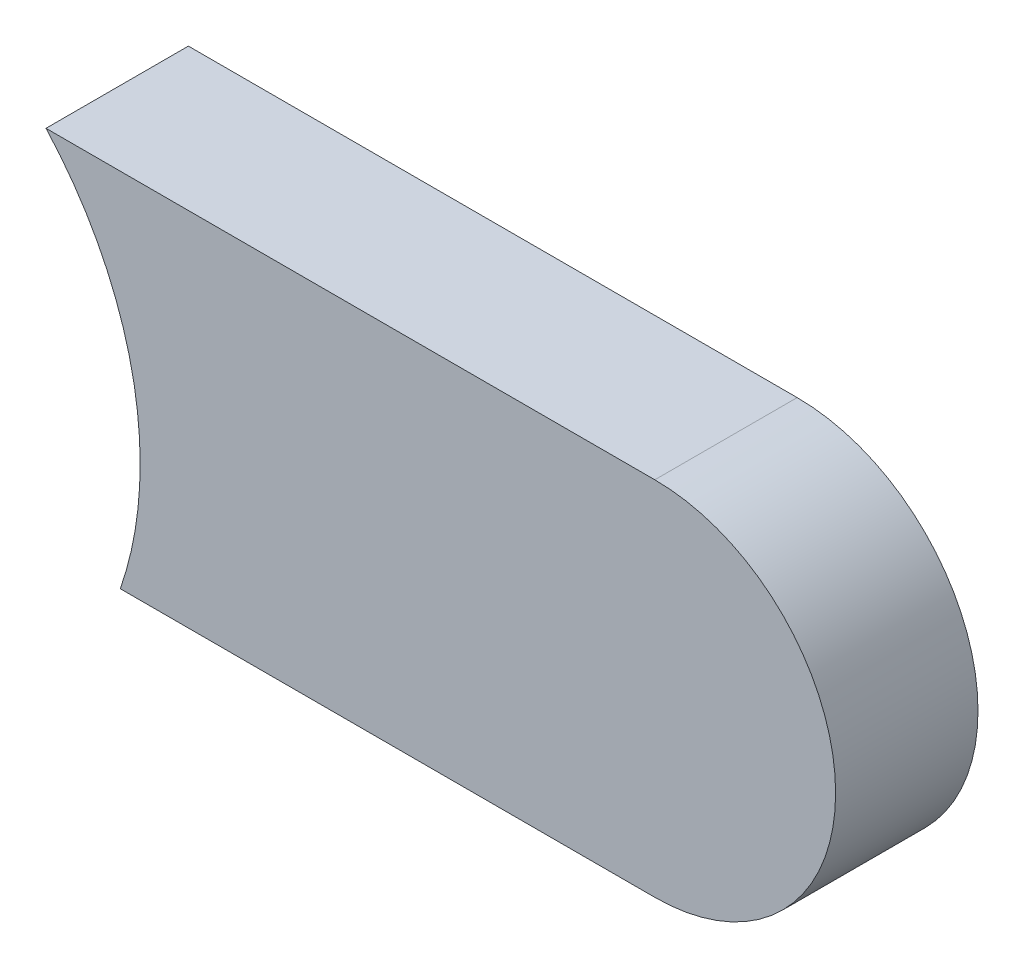
ISO-10303-21;
HEADER;
FILE_DESCRIPTION(('STEP AP214'),'2;1');
FILE_NAME('part.step','',(''),(''),'','','');
FILE_SCHEMA(('AUTOMOTIVE_DESIGN { 1 0 10303 214 1 1 1 1 }'));
ENDSEC;
DATA;
#1=APPLICATION_CONTEXT('core data for automotive mechanical design processes');
#2=APPLICATION_PROTOCOL_DEFINITION('international standard','automotive_design',2000,#1);
#3=PRODUCT_CONTEXT('',#1,'mechanical');
#4=PRODUCT('Part','Part','',(#3));
#5=PRODUCT_RELATED_PRODUCT_CATEGORY('part','',(#4));
#6=PRODUCT_DEFINITION_FORMATION('','',#4);
#7=PRODUCT_DEFINITION_CONTEXT('part definition',#1,'design');
#8=PRODUCT_DEFINITION('design','',#6,#7);
#9=PRODUCT_DEFINITION_SHAPE('','',#8);
#10=(LENGTH_UNIT() NAMED_UNIT(*) SI_UNIT(.MILLI.,.METRE.));
#11=(NAMED_UNIT(*) PLANE_ANGLE_UNIT() SI_UNIT($,.RADIAN.));
#12=(NAMED_UNIT(*) SI_UNIT($,.STERADIAN.) SOLID_ANGLE_UNIT());
#13=UNCERTAINTY_MEASURE_WITH_UNIT(LENGTH_MEASURE(1.E-05),#10,'distance_accuracy_value','');
#14=(GEOMETRIC_REPRESENTATION_CONTEXT(3) GLOBAL_UNCERTAINTY_ASSIGNED_CONTEXT((#13)) GLOBAL_UNIT_ASSIGNED_CONTEXT((#10,
#11,#12)) REPRESENTATION_CONTEXT('',''));
#15=CARTESIAN_POINT('',(0.,0.,0.));
#16=DIRECTION('',(0.,0.,1.));
#17=DIRECTION('',(1.,0.,0.));
#18=AXIS2_PLACEMENT_3D('',#15,#16,#17);
#19=CARTESIAN_POINT('',(153.261089060208,71.33493226,0.));
#20=DIRECTION('',(0.,1.,0.));
#21=DIRECTION('',(1.,0.,0.));
#22=AXIS2_PLACEMENT_3D('',#19,#20,#21);
#23=PLANE('',#22);
#24=DIRECTION('',(1.,0.,0.));
#25=VECTOR('',#24,1.);
#26=CARTESIAN_POINT('',(152.86893226,71.33493226,0.1999996));
#27=LINE('',#26,#25);
#28=CARTESIAN_POINT('',(153.261089060208,71.33493226,0.1999996));
#29=VERTEX_POINT('',#28);
#30=CARTESIAN_POINT('',(154.01193226,71.33493226,0.1999996));
#31=VERTEX_POINT('',#30);
#32=EDGE_CURVE('E11',#29,#31,#27,.T.);
#33=ORIENTED_EDGE('',*,*,#32,.F.);
#34=DIRECTION('',(0.,0.,1.));
#35=VECTOR('',#34,1.);
#36=CARTESIAN_POINT('',(153.261089060208,71.33493226,0.));
#37=LINE('',#36,#35);
#38=CARTESIAN_POINT('',(153.261089060208,71.33493226,0.));
#39=VERTEX_POINT('',#38);
#40=EDGE_CURVE('E24',#39,#29,#37,.T.);
#41=ORIENTED_EDGE('',*,*,#40,.F.);
#42=DIRECTION('',(1.,0.,0.));
#43=VECTOR('',#42,1.);
#44=CARTESIAN_POINT('',(152.86893226,71.33493226,0.));
#45=LINE('',#44,#43);
#46=CARTESIAN_POINT('',(154.01193226,71.33493226,0.));
#47=VERTEX_POINT('',#46);
#48=EDGE_CURVE('E82',#39,#47,#45,.T.);
#49=ORIENTED_EDGE('',*,*,#48,.T.);
#50=DIRECTION('',(0.,0.,1.));
#51=VECTOR('',#50,1.);
#52=CARTESIAN_POINT('',(154.01193226,71.33493226,0.));
#53=LINE('',#52,#51);
#54=EDGE_CURVE('E37',#47,#31,#53,.T.);
#55=ORIENTED_EDGE('',*,*,#54,.T.);
#56=EDGE_LOOP('',(#33,#41,#49,#55));
#57=FACE_BOUND('',#56,.T.);
#58=ADVANCED_FACE('F17',(#57),#23,.F.);
#59=CARTESIAN_POINT('',(154.01193226,71.58893226,0.));
#60=DIRECTION('',(0.,0.,-1.));
#61=DIRECTION('',(0.,-1.,0.));
#62=AXIS2_PLACEMENT_3D('',#59,#60,#61);
#63=CYLINDRICAL_SURFACE('',#62,0.253999999999995);
#64=CARTESIAN_POINT('',(154.01193226,71.58893226,0.1999996));
#65=DIRECTION('',(0.,0.,1.));
#66=DIRECTION('',(0.,-1.,0.));
#67=AXIS2_PLACEMENT_3D('',#64,#65,#66);
#68=CIRCLE('',#67,0.253999999999995);
#69=CARTESIAN_POINT('',(154.01193226,71.84293226,0.1999996));
#70=VERTEX_POINT('',#69);
#71=EDGE_CURVE('E97',#31,#70,#68,.T.);
#72=ORIENTED_EDGE('',*,*,#71,.F.);
#73=ORIENTED_EDGE('',*,*,#54,.F.);
#74=CARTESIAN_POINT('',(154.01193226,71.58893226,0.));
#75=DIRECTION('',(0.,0.,1.));
#76=DIRECTION('',(0.,-1.,0.));
#77=AXIS2_PLACEMENT_3D('',#74,#75,#76);
#78=CIRCLE('',#77,0.253999999999995);
#79=CARTESIAN_POINT('',(154.01193226,71.84293226,0.));
#80=VERTEX_POINT('',#79);
#81=EDGE_CURVE('E94',#47,#80,#78,.T.);
#82=ORIENTED_EDGE('',*,*,#81,.T.);
#83=DIRECTION('',(0.,0.,1.));
#84=VECTOR('',#83,1.);
#85=CARTESIAN_POINT('',(154.01193226,71.84293226,0.));
#86=LINE('',#85,#84);
#87=EDGE_CURVE('E92',#80,#70,#86,.T.);
#88=ORIENTED_EDGE('',*,*,#87,.T.);
#89=EDGE_LOOP('',(#72,#73,#82,#88));
#90=FACE_BOUND('',#89,.T.);
#91=ADVANCED_FACE('F103',(#90),#63,.T.);
#92=CARTESIAN_POINT('',(154.01193226,71.84293226,0.));
#93=DIRECTION('',(0.,-1.,0.));
#94=DIRECTION('',(-1.,0.,0.));
#95=AXIS2_PLACEMENT_3D('',#92,#93,#94);
#96=PLANE('',#95);
#97=DIRECTION('',(-1.,0.,0.));
#98=VECTOR('',#97,1.);
#99=CARTESIAN_POINT('',(154.01193226,71.84293226,0.1999996));
#100=LINE('',#99,#98);
#101=CARTESIAN_POINT('',(153.156694463056,71.84293226,0.1999996));
#102=VERTEX_POINT('',#101);
#103=EDGE_CURVE('E89',#70,#102,#100,.T.);
#104=ORIENTED_EDGE('',*,*,#103,.F.);
#105=ORIENTED_EDGE('',*,*,#87,.F.);
#106=DIRECTION('',(-1.,0.,0.));
#107=VECTOR('',#106,1.);
#108=CARTESIAN_POINT('',(154.01193226,71.84293226,0.));
#109=LINE('',#108,#107);
#110=CARTESIAN_POINT('',(153.156694463056,71.84293226,0.));
#111=VERTEX_POINT('',#110);
#112=EDGE_CURVE('E87',#80,#111,#109,.T.);
#113=ORIENTED_EDGE('',*,*,#112,.T.);
#114=DIRECTION('',(0.,0.,1.));
#115=VECTOR('',#114,1.);
#116=CARTESIAN_POINT('',(153.156694463056,71.84293226,0.));
#117=LINE('',#116,#115);
#118=EDGE_CURVE('E69',#111,#102,#117,.T.);
#119=ORIENTED_EDGE('',*,*,#118,.T.);
#120=EDGE_LOOP('',(#104,#105,#113,#119));
#121=FACE_BOUND('',#120,.T.);
#122=ADVANCED_FACE('F108',(#121),#96,.F.);
#123=CARTESIAN_POINT('',(152.781,71.501,0.));
#124=DIRECTION('',(0.,0.,-1.));
#125=DIRECTION('',(1.,0.,0.));
#126=AXIS2_PLACEMENT_3D('',#123,#124,#125);
#127=CYLINDRICAL_SURFACE('',#126,0.508);
#128=DIRECTION('',(0.,0.,1.));
#129=VECTOR('',#128,1.);
#130=CARTESIAN_POINT('',(153.289,71.501,0.));
#131=LINE('',#130,#129);
#132=CARTESIAN_POINT('',(153.289,71.501,0.));
#133=VERTEX_POINT('',#132);
#134=CARTESIAN_POINT('',(153.289,71.501,0.1999996));
#135=VERTEX_POINT('',#134);
#136=EDGE_CURVE('E59',#133,#135,#131,.T.);
#137=ORIENTED_EDGE('',*,*,#136,.T.);
#138=CARTESIAN_POINT('',(152.781,71.501,0.1999996));
#139=DIRECTION('',(0.,0.,1.));
#140=DIRECTION('',(1.,0.,0.));
#141=AXIS2_PLACEMENT_3D('',#138,#139,#140);
#142=CIRCLE('',#141,0.508);
#143=EDGE_CURVE('E70',#135,#102,#142,.T.);
#144=ORIENTED_EDGE('',*,*,#143,.T.);
#145=ORIENTED_EDGE('',*,*,#118,.F.);
#146=CARTESIAN_POINT('',(152.781,71.501,0.));
#147=DIRECTION('',(0.,0.,1.));
#148=DIRECTION('',(1.,0.,0.));
#149=AXIS2_PLACEMENT_3D('',#146,#147,#148);
#150=CIRCLE('',#149,0.508);
#151=EDGE_CURVE('E73',#133,#111,#150,.T.);
#152=ORIENTED_EDGE('',*,*,#151,.F.);
#153=EDGE_LOOP('',(#137,#144,#145,#152));
#154=FACE_BOUND('',#153,.T.);
#155=ADVANCED_FACE('F74',(#154),#127,.F.);
#156=CARTESIAN_POINT('',(152.781,71.501,0.));
#157=DIRECTION('',(0.,0.,-1.));
#158=DIRECTION('',(1.,0.,0.));
#159=AXIS2_PLACEMENT_3D('',#156,#157,#158);
#160=CYLINDRICAL_SURFACE('',#159,0.508);
#161=ORIENTED_EDGE('',*,*,#40,.T.);
#162=CARTESIAN_POINT('',(152.781,71.501,0.1999996));
#163=DIRECTION('',(0.,0.,1.));
#164=DIRECTION('',(1.,0.,0.));
#165=AXIS2_PLACEMENT_3D('',#162,#163,#164);
#166=CIRCLE('',#165,0.508);
#167=EDGE_CURVE('E65',#29,#135,#166,.T.);
#168=ORIENTED_EDGE('',*,*,#167,.T.);
#169=ORIENTED_EDGE('',*,*,#136,.F.);
#170=EDGE_CURVE('E63',#39,#133,#150,.T.);
#171=ORIENTED_EDGE('',*,*,#170,.F.);
#172=EDGE_LOOP('',(#161,#168,#169,#171));
#173=FACE_BOUND('',#172,.T.);
#174=ADVANCED_FACE('F61',(#173),#160,.F.);
#175=CARTESIAN_POINT('',(152.86893226,71.33493226,0.));
#176=DIRECTION('',(0.,0.,-1.));
#177=DIRECTION('',(-1.,0.,0.));
#178=AXIS2_PLACEMENT_3D('',#175,#176,#177);
#179=PLANE('',#178);
#180=ORIENTED_EDGE('',*,*,#48,.F.);
#181=ORIENTED_EDGE('',*,*,#170,.T.);
#182=ORIENTED_EDGE('',*,*,#151,.T.);
#183=ORIENTED_EDGE('',*,*,#112,.F.);
#184=ORIENTED_EDGE('',*,*,#81,.F.);
#185=EDGE_LOOP('',(#180,#181,#182,#183,#184));
#186=FACE_BOUND('',#185,.T.);
#187=ADVANCED_FACE('F80',(#186),#179,.T.);
#188=CARTESIAN_POINT('',(152.86893226,71.33493226,0.1999996));
#189=DIRECTION('',(0.,0.,-1.));
#190=DIRECTION('',(-1.,0.,0.));
#191=AXIS2_PLACEMENT_3D('',#188,#189,#190);
#192=PLANE('',#191);
#193=ORIENTED_EDGE('',*,*,#167,.F.);
#194=ORIENTED_EDGE('',*,*,#32,.T.);
#195=ORIENTED_EDGE('',*,*,#71,.T.);
#196=ORIENTED_EDGE('',*,*,#103,.T.);
#197=ORIENTED_EDGE('',*,*,#143,.F.);
#198=EDGE_LOOP('',(#193,#194,#195,#196,#197));
#199=FACE_BOUND('',#198,.T.);
#200=ADVANCED_FACE('F106',(#199),#192,.F.);
#201=CLOSED_SHELL('',(#58,#91,#122,#155,#174,#187,#200));
#202=MANIFOLD_SOLID_BREP('B1',#201);
#203=ADVANCED_BREP_SHAPE_REPRESENTATION('',(#18,#202),#14);
#204=SHAPE_DEFINITION_REPRESENTATION(#9,#203);
ENDSEC;
END-ISO-10303-21;
